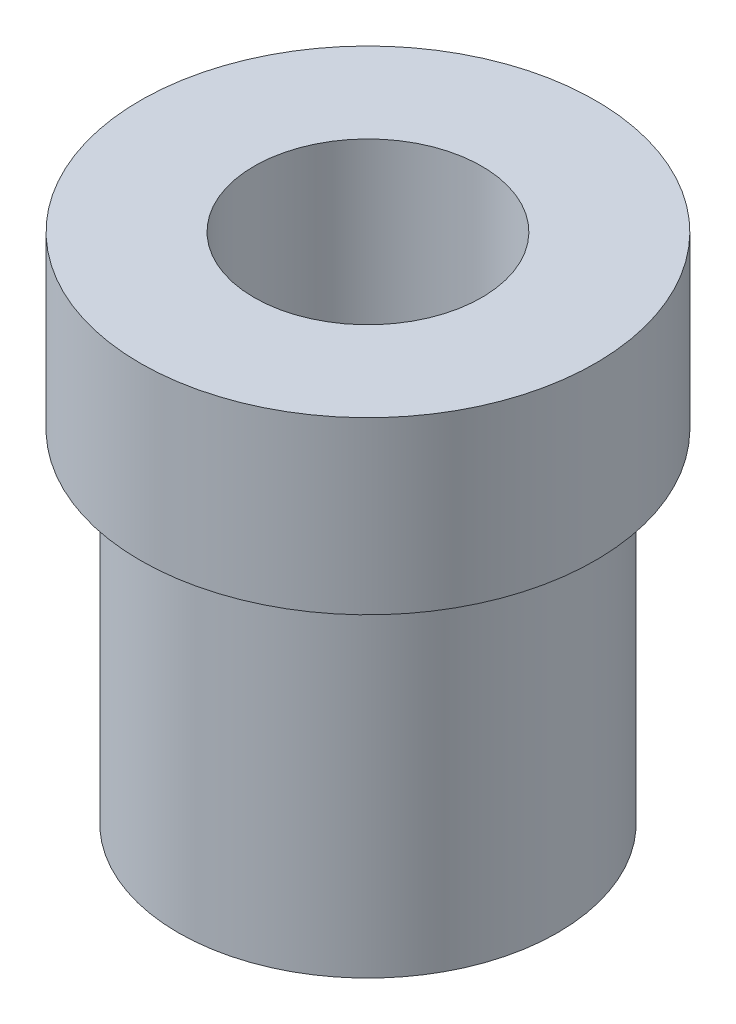
ISO-10303-21;
HEADER;
FILE_DESCRIPTION(('STEP AP214'),'2;1');
FILE_NAME('part.step','',(''),(''),'','','');
FILE_SCHEMA(('AUTOMOTIVE_DESIGN { 1 0 10303 214 1 1 1 1 }'));
ENDSEC;
DATA;
#1=APPLICATION_CONTEXT('core data for automotive mechanical design processes');
#2=APPLICATION_PROTOCOL_DEFINITION('international standard','automotive_design',2000,#1);
#3=PRODUCT_CONTEXT('',#1,'mechanical');
#4=PRODUCT('Part','Part','',(#3));
#5=PRODUCT_RELATED_PRODUCT_CATEGORY('part','',(#4));
#6=PRODUCT_DEFINITION_FORMATION('','',#4);
#7=PRODUCT_DEFINITION_CONTEXT('part definition',#1,'design');
#8=PRODUCT_DEFINITION('design','',#6,#7);
#9=PRODUCT_DEFINITION_SHAPE('','',#8);
#10=(LENGTH_UNIT() NAMED_UNIT(*) SI_UNIT(.MILLI.,.METRE.));
#11=(NAMED_UNIT(*) PLANE_ANGLE_UNIT() SI_UNIT($,.RADIAN.));
#12=(NAMED_UNIT(*) SI_UNIT($,.STERADIAN.) SOLID_ANGLE_UNIT());
#13=UNCERTAINTY_MEASURE_WITH_UNIT(LENGTH_MEASURE(1.E-05),#10,'distance_accuracy_value','');
#14=(GEOMETRIC_REPRESENTATION_CONTEXT(3) GLOBAL_UNCERTAINTY_ASSIGNED_CONTEXT((#13)) GLOBAL_UNIT_ASSIGNED_CONTEXT((#10,
#11,#12)) REPRESENTATION_CONTEXT('',''));
#15=CARTESIAN_POINT('',(0.,0.,0.));
#16=DIRECTION('',(0.,0.,1.));
#17=DIRECTION('',(1.,0.,0.));
#18=AXIS2_PLACEMENT_3D('',#15,#16,#17);
#19=CARTESIAN_POINT('',(6.,0.,0.));
#20=DIRECTION('',(0.,-1.,0.));
#21=DIRECTION('',(0.,0.,-1.));
#22=AXIS2_PLACEMENT_3D('',#19,#20,#21);
#23=PLANE('',#22);
#24=CARTESIAN_POINT('',(0.,0.,0.));
#25=DIRECTION('',(0.,1.,0.));
#26=DIRECTION('',(0.,0.,1.));
#27=AXIS2_PLACEMENT_3D('',#24,#25,#26);
#28=CIRCLE('',#27,3.);
#29=CARTESIAN_POINT('',(0.,0.,3.));
#30=VERTEX_POINT('',#29);
#31=EDGE_CURVE('E10',#30,#30,#28,.T.);
#32=ORIENTED_EDGE('',*,*,#31,.F.);
#33=EDGE_LOOP('',(#32));
#34=FACE_BOUND('',#33,.T.);
#35=CARTESIAN_POINT('',(0.,0.,0.));
#36=DIRECTION('',(0.,1.,0.));
#37=DIRECTION('',(0.,0.,1.));
#38=AXIS2_PLACEMENT_3D('',#35,#36,#37);
#39=CIRCLE('',#38,6.);
#40=CARTESIAN_POINT('',(0.,0.,6.));
#41=VERTEX_POINT('',#40);
#42=EDGE_CURVE('E58',#41,#41,#39,.T.);
#43=ORIENTED_EDGE('',*,*,#42,.T.);
#44=EDGE_LOOP('',(#43));
#45=FACE_BOUND('',#44,.T.);
#46=ADVANCED_FACE('F36',(#34,#45),#23,.F.);
#47=CARTESIAN_POINT('',(0.,12.4296947208098,0.));
#48=DIRECTION('',(0.,1.,0.));
#49=DIRECTION('',(0.,0.,1.));
#50=AXIS2_PLACEMENT_3D('',#47,#48,#49);
#51=CYLINDRICAL_SURFACE('',#50,3.);
#52=CARTESIAN_POINT('',(0.,-13.5,0.));
#53=DIRECTION('',(0.,1.,0.));
#54=DIRECTION('',(0.,0.,1.));
#55=AXIS2_PLACEMENT_3D('',#52,#53,#54);
#56=CIRCLE('',#55,3.);
#57=CARTESIAN_POINT('',(0.,-13.5,3.));
#58=VERTEX_POINT('',#57);
#59=EDGE_CURVE('E42',#58,#58,#56,.T.);
#60=ORIENTED_EDGE('',*,*,#59,.F.);
#61=EDGE_LOOP('',(#60));
#62=FACE_BOUND('',#61,.T.);
#63=ORIENTED_EDGE('',*,*,#31,.T.);
#64=EDGE_LOOP('',(#63));
#65=FACE_BOUND('',#64,.T.);
#66=ADVANCED_FACE('F83',(#62,#65),#51,.F.);
#67=CARTESIAN_POINT('',(3.,-13.5,0.));
#68=DIRECTION('',(0.,1.,0.));
#69=DIRECTION('',(0.,0.,1.));
#70=AXIS2_PLACEMENT_3D('',#67,#68,#69);
#71=PLANE('',#70);
#72=CARTESIAN_POINT('',(0.,-13.5,0.));
#73=DIRECTION('',(0.,1.,0.));
#74=DIRECTION('',(0.,0.,1.));
#75=AXIS2_PLACEMENT_3D('',#72,#73,#74);
#76=CIRCLE('',#75,5.);
#77=CARTESIAN_POINT('',(0.,-13.5,5.));
#78=VERTEX_POINT('',#77);
#79=EDGE_CURVE('E46',#78,#78,#76,.T.);
#80=ORIENTED_EDGE('',*,*,#79,.F.);
#81=EDGE_LOOP('',(#80));
#82=FACE_BOUND('',#81,.T.);
#83=ORIENTED_EDGE('',*,*,#59,.T.);
#84=EDGE_LOOP('',(#83));
#85=FACE_BOUND('',#84,.T.);
#86=ADVANCED_FACE('F78',(#82,#85),#71,.F.);
#87=CARTESIAN_POINT('',(0.,12.4296947208098,0.));
#88=DIRECTION('',(0.,1.,0.));
#89=DIRECTION('',(0.,0.,1.));
#90=AXIS2_PLACEMENT_3D('',#87,#88,#89);
#91=CYLINDRICAL_SURFACE('',#90,5.);
#92=CARTESIAN_POINT('',(0.,-4.5,0.));
#93=DIRECTION('',(0.,1.,0.));
#94=DIRECTION('',(0.,0.,1.));
#95=AXIS2_PLACEMENT_3D('',#92,#93,#94);
#96=CIRCLE('',#95,5.);
#97=CARTESIAN_POINT('',(0.,-4.5,5.));
#98=VERTEX_POINT('',#97);
#99=EDGE_CURVE('E50',#98,#98,#96,.T.);
#100=ORIENTED_EDGE('',*,*,#99,.F.);
#101=EDGE_LOOP('',(#100));
#102=FACE_BOUND('',#101,.T.);
#103=ORIENTED_EDGE('',*,*,#79,.T.);
#104=EDGE_LOOP('',(#103));
#105=FACE_BOUND('',#104,.T.);
#106=ADVANCED_FACE('F72',(#102,#105),#91,.T.);
#107=CARTESIAN_POINT('',(5.,-4.5,0.));
#108=DIRECTION('',(0.,1.,0.));
#109=DIRECTION('',(0.,0.,1.));
#110=AXIS2_PLACEMENT_3D('',#107,#108,#109);
#111=PLANE('',#110);
#112=CARTESIAN_POINT('',(0.,-4.5,0.));
#113=DIRECTION('',(0.,1.,0.));
#114=DIRECTION('',(0.,0.,1.));
#115=AXIS2_PLACEMENT_3D('',#112,#113,#114);
#116=CIRCLE('',#115,6.);
#117=CARTESIAN_POINT('',(0.,-4.5,6.));
#118=VERTEX_POINT('',#117);
#119=EDGE_CURVE('E55',#118,#118,#116,.T.);
#120=ORIENTED_EDGE('',*,*,#119,.F.);
#121=EDGE_LOOP('',(#120));
#122=FACE_BOUND('',#121,.T.);
#123=ORIENTED_EDGE('',*,*,#99,.T.);
#124=EDGE_LOOP('',(#123));
#125=FACE_BOUND('',#124,.T.);
#126=ADVANCED_FACE('F66',(#122,#125),#111,.F.);
#127=CARTESIAN_POINT('',(0.,12.4296947208098,0.));
#128=DIRECTION('',(0.,1.,0.));
#129=DIRECTION('',(0.,0.,1.));
#130=AXIS2_PLACEMENT_3D('',#127,#128,#129);
#131=CYLINDRICAL_SURFACE('',#130,6.);
#132=ORIENTED_EDGE('',*,*,#42,.F.);
#133=EDGE_LOOP('',(#132));
#134=FACE_BOUND('',#133,.T.);
#135=ORIENTED_EDGE('',*,*,#119,.T.);
#136=EDGE_LOOP('',(#135));
#137=FACE_BOUND('',#136,.T.);
#138=ADVANCED_FACE('F63',(#134,#137),#131,.T.);
#139=CLOSED_SHELL('',(#46,#66,#86,#106,#126,#138));
#140=MANIFOLD_SOLID_BREP('B2',#139);
#141=ADVANCED_BREP_SHAPE_REPRESENTATION('',(#18,#140),#14);
#142=SHAPE_DEFINITION_REPRESENTATION(#9,#141);
ENDSEC;
END-ISO-10303-21;
